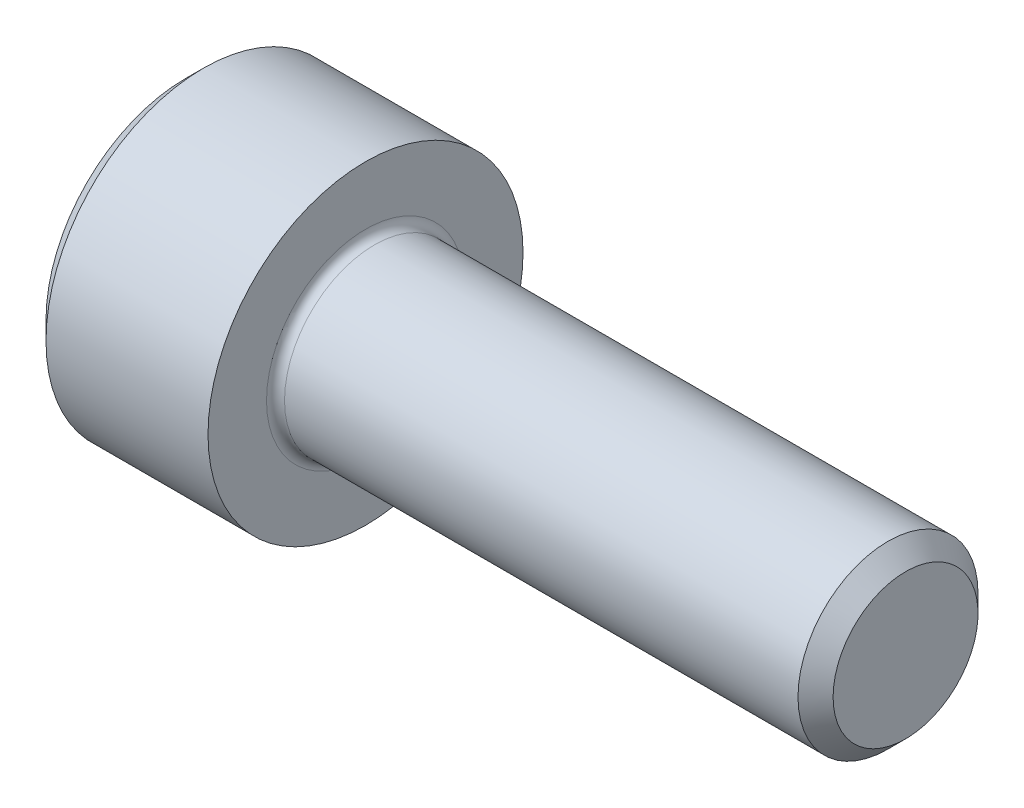
ISO-10303-21;
HEADER;
FILE_DESCRIPTION(('STEP AP214'),'2;1');
FILE_NAME('part.step','',(''),(''),'','','');
FILE_SCHEMA(('AUTOMOTIVE_DESIGN { 1 0 10303 214 1 1 1 1 }'));
ENDSEC;
DATA;
#1=APPLICATION_CONTEXT('core data for automotive mechanical design processes');
#2=APPLICATION_PROTOCOL_DEFINITION('international standard','automotive_design',2000,#1);
#3=PRODUCT_CONTEXT('',#1,'mechanical');
#4=PRODUCT('Part','Part','',(#3));
#5=PRODUCT_RELATED_PRODUCT_CATEGORY('part','',(#4));
#6=PRODUCT_DEFINITION_FORMATION('','',#4);
#7=PRODUCT_DEFINITION_CONTEXT('part definition',#1,'design');
#8=PRODUCT_DEFINITION('design','',#6,#7);
#9=PRODUCT_DEFINITION_SHAPE('','',#8);
#10=(LENGTH_UNIT() NAMED_UNIT(*) SI_UNIT(.MILLI.,.METRE.));
#11=(NAMED_UNIT(*) PLANE_ANGLE_UNIT() SI_UNIT($,.RADIAN.));
#12=(NAMED_UNIT(*) SI_UNIT($,.STERADIAN.) SOLID_ANGLE_UNIT());
#13=UNCERTAINTY_MEASURE_WITH_UNIT(LENGTH_MEASURE(1.E-05),#10,'distance_accuracy_value','');
#14=(GEOMETRIC_REPRESENTATION_CONTEXT(3) GLOBAL_UNCERTAINTY_ASSIGNED_CONTEXT((#13)) GLOBAL_UNIT_ASSIGNED_CONTEXT((#10,
#11,#12)) REPRESENTATION_CONTEXT('',''));
#15=CARTESIAN_POINT('',(0.,0.,0.));
#16=DIRECTION('',(0.,0.,1.));
#17=DIRECTION('',(1.,0.,0.));
#18=AXIS2_PLACEMENT_3D('',#15,#16,#17);
#19=CARTESIAN_POINT('',(0.,0.,0.));
#20=DIRECTION('',(-1.,0.,0.));
#21=DIRECTION('',(0.,0.,1.));
#22=AXIS2_PLACEMENT_3D('',#19,#20,#21);
#23=PLANE('',#22);
#24=DIRECTION('',(0.,-0.499999999999999,0.86602540378444));
#25=VECTOR('',#24,1.);
#26=CARTESIAN_POINT('',(0.,1.77304267668134,0.));
#27=LINE('',#26,#25);
#28=CARTESIAN_POINT('',(0.,1.77304267668134,0.));
#29=VERTEX_POINT('',#28);
#30=CARTESIAN_POINT('',(0.,0.88652133834067,1.5355));
#31=VERTEX_POINT('',#30);
#32=EDGE_CURVE('E390',#29,#31,#27,.T.);
#33=ORIENTED_EDGE('',*,*,#32,.T.);
#34=DIRECTION('',(0.,1.,0.));
#35=VECTOR('',#34,1.);
#36=CARTESIAN_POINT('',(0.,-0.886521338340672,1.5355));
#37=LINE('',#36,#35);
#38=CARTESIAN_POINT('',(0.,-0.886521338340672,1.5355));
#39=VERTEX_POINT('',#38);
#40=EDGE_CURVE('E126',#39,#31,#37,.T.);
#41=ORIENTED_EDGE('',*,*,#40,.F.);
#42=DIRECTION('',(0.,-0.500000000000001,-0.866025403784438));
#43=VECTOR('',#42,1.);
#44=CARTESIAN_POINT('',(0.,-0.886521338340672,1.5355));
#45=LINE('',#44,#43);
#46=CARTESIAN_POINT('',(0.,-1.77304267668134,0.));
#47=VERTEX_POINT('',#46);
#48=EDGE_CURVE('E393',#39,#47,#45,.T.);
#49=ORIENTED_EDGE('',*,*,#48,.T.);
#50=DIRECTION('',(0.,0.499999999999999,-0.86602540378444));
#51=VECTOR('',#50,1.);
#52=CARTESIAN_POINT('',(0.,-1.77304267668134,0.));
#53=LINE('',#52,#51);
#54=CARTESIAN_POINT('',(0.,-0.886521338340676,-1.5355));
#55=VERTEX_POINT('',#54);
#56=EDGE_CURVE('E396',#47,#55,#53,.T.);
#57=ORIENTED_EDGE('',*,*,#56,.T.);
#58=DIRECTION('',(0.,-1.,0.));
#59=VECTOR('',#58,1.);
#60=CARTESIAN_POINT('',(0.,0.886521338340665,-1.5355));
#61=LINE('',#60,#59);
#62=CARTESIAN_POINT('',(0.,0.886521338340665,-1.5355));
#63=VERTEX_POINT('',#62);
#64=EDGE_CURVE('E399',#63,#55,#61,.T.);
#65=ORIENTED_EDGE('',*,*,#64,.F.);
#66=DIRECTION('',(0.,-0.500000000000001,-0.866025403784438));
#67=VECTOR('',#66,1.);
#68=CARTESIAN_POINT('',(0.,1.77304267668134,0.));
#69=LINE('',#68,#67);
#70=EDGE_CURVE('E121',#29,#63,#69,.T.);
#71=ORIENTED_EDGE('',*,*,#70,.F.);
#72=EDGE_LOOP('',(#33,#41,#49,#57,#65,#71));
#73=FACE_BOUND('',#72,.T.);
#74=CARTESIAN_POINT('',(0.,0.,0.));
#75=DIRECTION('',(-1.,0.,0.));
#76=DIRECTION('',(0.,0.,1.));
#77=AXIS2_PLACEMENT_3D('',#74,#75,#76);
#78=CIRCLE('',#77,3.10000000000001);
#79=CARTESIAN_POINT('',(0.,0.,3.10000000000001));
#80=VERTEX_POINT('',#79);
#81=EDGE_CURVE('E137',#80,#80,#78,.T.);
#82=ORIENTED_EDGE('',*,*,#81,.T.);
#83=EDGE_LOOP('',(#82));
#84=FACE_BOUND('',#83,.T.);
#85=ADVANCED_FACE('F34',(#73,#84),#23,.T.);
#86=CARTESIAN_POINT('',(16.,1.61,0.));
#87=DIRECTION('',(1.,0.,0.));
#88=DIRECTION('',(0.,0.,-1.));
#89=AXIS2_PLACEMENT_3D('',#86,#87,#88);
#90=PLANE('',#89);
#91=CARTESIAN_POINT('',(16.,0.,0.));
#92=DIRECTION('',(-1.,0.,0.));
#93=DIRECTION('',(0.,0.,1.));
#94=AXIS2_PLACEMENT_3D('',#91,#92,#93);
#95=CIRCLE('',#94,1.61);
#96=CARTESIAN_POINT('',(16.,0.,1.61));
#97=VERTEX_POINT('',#96);
#98=EDGE_CURVE('E150',#97,#97,#95,.T.);
#99=ORIENTED_EDGE('',*,*,#98,.F.);
#100=EDGE_LOOP('',(#99));
#101=FACE_BOUND('',#100,.T.);
#102=ADVANCED_FACE('F171',(#101),#90,.T.);
#103=CARTESIAN_POINT('',(16.,0.,0.));
#104=DIRECTION('',(-1.,0.,0.));
#105=DIRECTION('',(0.,0.,1.));
#106=AXIS2_PLACEMENT_3D('',#103,#104,#105);
#107=CONICAL_SURFACE('',#106,1.61,0.785398163397484);
#108=CARTESIAN_POINT('',(15.61,0.,0.));
#109=DIRECTION('',(-1.,0.,0.));
#110=DIRECTION('',(0.,0.,1.));
#111=AXIS2_PLACEMENT_3D('',#108,#109,#110);
#112=CIRCLE('',#111,2.);
#113=CARTESIAN_POINT('',(15.61,0.,2.));
#114=VERTEX_POINT('',#113);
#115=EDGE_CURVE('E147',#114,#114,#112,.T.);
#116=ORIENTED_EDGE('',*,*,#115,.F.);
#117=EDGE_LOOP('',(#116));
#118=FACE_BOUND('',#117,.T.);
#119=ORIENTED_EDGE('',*,*,#98,.T.);
#120=EDGE_LOOP('',(#119));
#121=FACE_BOUND('',#120,.T.);
#122=ADVANCED_FACE('F177',(#118,#121),#107,.T.);
#123=CARTESIAN_POINT('',(-31.75,0.,0.));
#124=DIRECTION('',(-1.,0.,0.));
#125=DIRECTION('',(0.,0.,1.));
#126=AXIS2_PLACEMENT_3D('',#123,#124,#125);
#127=CYLINDRICAL_SURFACE('',#126,2.);
#128=CARTESIAN_POINT('',(4.2,0.,0.));
#129=DIRECTION('',(1.,0.,0.));
#130=DIRECTION('',(0.,0.,-1.));
#131=AXIS2_PLACEMENT_3D('',#128,#129,#130);
#132=CIRCLE('',#131,2.);
#133=CARTESIAN_POINT('',(4.2,0.,-2.));
#134=VERTEX_POINT('',#133);
#135=EDGE_CURVE('E11',#134,#134,#132,.T.);
#136=ORIENTED_EDGE('',*,*,#135,.T.);
#137=EDGE_LOOP('',(#136));
#138=FACE_BOUND('',#137,.T.);
#139=ORIENTED_EDGE('',*,*,#115,.T.);
#140=EDGE_LOOP('',(#139));
#141=FACE_BOUND('',#140,.T.);
#142=ADVANCED_FACE('F188',(#138,#141),#127,.T.);
#143=CARTESIAN_POINT('',(4.,3.5,0.));
#144=DIRECTION('',(1.,0.,0.));
#145=DIRECTION('',(0.,0.,-1.));
#146=AXIS2_PLACEMENT_3D('',#143,#144,#145);
#147=PLANE('',#146);
#148=CARTESIAN_POINT('',(4.,0.,0.));
#149=DIRECTION('',(1.,0.,0.));
#150=DIRECTION('',(0.,0.,-1.));
#151=AXIS2_PLACEMENT_3D('',#148,#149,#150);
#152=CIRCLE('',#151,2.2);
#153=CARTESIAN_POINT('',(4.,0.,-2.2));
#154=VERTEX_POINT('',#153);
#155=EDGE_CURVE('E42',#154,#154,#152,.F.);
#156=ORIENTED_EDGE('',*,*,#155,.T.);
#157=EDGE_LOOP('',(#156));
#158=FACE_BOUND('',#157,.T.);
#159=CARTESIAN_POINT('',(4.,0.,0.));
#160=DIRECTION('',(-1.,0.,0.));
#161=DIRECTION('',(0.,0.,1.));
#162=AXIS2_PLACEMENT_3D('',#159,#160,#161);
#163=CIRCLE('',#162,3.5);
#164=CARTESIAN_POINT('',(4.,0.,3.5));
#165=VERTEX_POINT('',#164);
#166=EDGE_CURVE('E144',#165,#165,#163,.T.);
#167=ORIENTED_EDGE('',*,*,#166,.F.);
#168=EDGE_LOOP('',(#167));
#169=FACE_BOUND('',#168,.T.);
#170=ADVANCED_FACE('F155',(#158,#169),#147,.T.);
#171=CARTESIAN_POINT('',(-31.75,0.,0.));
#172=DIRECTION('',(-1.,0.,0.));
#173=DIRECTION('',(0.,0.,1.));
#174=AXIS2_PLACEMENT_3D('',#171,#172,#173);
#175=CYLINDRICAL_SURFACE('',#174,3.5);
#176=ORIENTED_EDGE('',*,*,#166,.T.);
#177=EDGE_LOOP('',(#176));
#178=FACE_BOUND('',#177,.T.);
#179=CARTESIAN_POINT('',(0.399999999999998,0.,0.));
#180=DIRECTION('',(-1.,0.,0.));
#181=DIRECTION('',(0.,0.,1.));
#182=AXIS2_PLACEMENT_3D('',#179,#180,#181);
#183=CIRCLE('',#182,3.5);
#184=CARTESIAN_POINT('',(0.399999999999998,0.,3.5));
#185=VERTEX_POINT('',#184);
#186=EDGE_CURVE('E141',#185,#185,#183,.T.);
#187=ORIENTED_EDGE('',*,*,#186,.F.);
#188=EDGE_LOOP('',(#187));
#189=FACE_BOUND('',#188,.T.);
#190=ADVANCED_FACE('F166',(#178,#189),#175,.T.);
#191=CARTESIAN_POINT('',(0.,0.,0.));
#192=DIRECTION('',(1.,0.,0.));
#193=DIRECTION('',(0.,0.,-1.));
#194=AXIS2_PLACEMENT_3D('',#191,#192,#193);
#195=CONICAL_SURFACE('',#194,3.10000000000001,0.785398163397442);
#196=ORIENTED_EDGE('',*,*,#186,.T.);
#197=EDGE_LOOP('',(#196));
#198=FACE_BOUND('',#197,.T.);
#199=ORIENTED_EDGE('',*,*,#81,.F.);
#200=EDGE_LOOP('',(#199));
#201=FACE_BOUND('',#200,.T.);
#202=ADVANCED_FACE('F159',(#198,#201),#195,.T.);
#203=CARTESIAN_POINT('',(4.2,0.,0.));
#204=DIRECTION('',(1.,0.,0.));
#205=DIRECTION('',(0.,0.,-1.));
#206=AXIS2_PLACEMENT_3D('',#203,#204,#205);
#207=TOROIDAL_SURFACE('',#206,2.2,0.2);
#208=ORIENTED_EDGE('',*,*,#135,.F.);
#209=EDGE_LOOP('',(#208));
#210=FACE_BOUND('',#209,.T.);
#211=ORIENTED_EDGE('',*,*,#155,.F.);
#212=EDGE_LOOP('',(#211));
#213=FACE_BOUND('',#212,.T.);
#214=ADVANCED_FACE('F36',(#210,#213),#207,.F.);
#215=CARTESIAN_POINT('',(2.,1.77304267668134,0.));
#216=DIRECTION('',(0.,-0.86602540378444,-0.499999999999999));
#217=DIRECTION('',(0.,0.499999999999999,-0.86602540378444));
#218=AXIS2_PLACEMENT_3D('',#215,#216,#217);
#219=PLANE('',#218);
#220=ORIENTED_EDGE('',*,*,#32,.F.);
#221=DIRECTION('',(-1.,0.,0.));
#222=VECTOR('',#221,1.);
#223=CARTESIAN_POINT('',(2.,1.77304267668134,0.));
#224=LINE('',#223,#222);
#225=CARTESIAN_POINT('',(2.,1.77304267668134,0.));
#226=VERTEX_POINT('',#225);
#227=EDGE_CURVE('E389',#226,#29,#224,.T.);
#228=ORIENTED_EDGE('',*,*,#227,.F.);
#229=DIRECTION('',(0.,-0.499999999999999,0.86602540378444));
#230=VECTOR('',#229,1.);
#231=CARTESIAN_POINT('',(2.,1.77304267668134,0.));
#232=LINE('',#231,#230);
#233=CARTESIAN_POINT('',(2.,1.32978200751101,0.767749999999998));
#234=VERTEX_POINT('',#233);
#235=EDGE_CURVE('E49',#226,#234,#232,.T.);
#236=ORIENTED_EDGE('',*,*,#235,.T.);
#237=CARTESIAN_POINT('',(2.,0.88652133834067,1.5355));
#238=VERTEX_POINT('',#237);
#239=EDGE_CURVE('E107',#234,#238,#232,.T.);
#240=ORIENTED_EDGE('',*,*,#239,.T.);
#241=DIRECTION('',(-1.,0.,0.));
#242=VECTOR('',#241,1.);
#243=CARTESIAN_POINT('',(2.,0.88652133834067,1.5355));
#244=LINE('',#243,#242);
#245=EDGE_CURVE('E119',#238,#31,#244,.T.);
#246=ORIENTED_EDGE('',*,*,#245,.T.);
#247=EDGE_LOOP('',(#220,#228,#236,#240,#246));
#248=FACE_BOUND('',#247,.T.);
#249=ADVANCED_FACE('F118',(#248),#219,.T.);
#250=CARTESIAN_POINT('',(2.,-0.886521338340672,1.5355));
#251=DIRECTION('',(0.,0.,1.));
#252=DIRECTION('',(0.,-1.,0.));
#253=AXIS2_PLACEMENT_3D('',#250,#251,#252);
#254=PLANE('',#253);
#255=ORIENTED_EDGE('',*,*,#40,.T.);
#256=ORIENTED_EDGE('',*,*,#245,.F.);
#257=DIRECTION('',(0.,1.,0.));
#258=VECTOR('',#257,1.);
#259=CARTESIAN_POINT('',(2.,-0.886521338340672,1.5355));
#260=LINE('',#259,#258);
#261=CARTESIAN_POINT('',(2.,0.,1.5355));
#262=VERTEX_POINT('',#261);
#263=EDGE_CURVE('E105',#262,#238,#260,.T.);
#264=ORIENTED_EDGE('',*,*,#263,.F.);
#265=CARTESIAN_POINT('',(2.,-0.886521338340672,1.5355));
#266=VERTEX_POINT('',#265);
#267=EDGE_CURVE('E115',#266,#262,#260,.T.);
#268=ORIENTED_EDGE('',*,*,#267,.F.);
#269=DIRECTION('',(-1.,0.,0.));
#270=VECTOR('',#269,1.);
#271=CARTESIAN_POINT('',(2.,-0.886521338340672,1.5355));
#272=LINE('',#271,#270);
#273=EDGE_CURVE('E128',#266,#39,#272,.T.);
#274=ORIENTED_EDGE('',*,*,#273,.T.);
#275=EDGE_LOOP('',(#255,#256,#264,#268,#274));
#276=FACE_BOUND('',#275,.T.);
#277=ADVANCED_FACE('F123',(#276),#254,.F.);
#278=CARTESIAN_POINT('',(2.,-0.886521338340672,1.5355));
#279=DIRECTION('',(0.,0.866025403784438,-0.500000000000001));
#280=DIRECTION('',(0.,0.500000000000001,0.866025403784438));
#281=AXIS2_PLACEMENT_3D('',#278,#279,#280);
#282=PLANE('',#281);
#283=ORIENTED_EDGE('',*,*,#48,.F.);
#284=ORIENTED_EDGE('',*,*,#273,.F.);
#285=DIRECTION('',(0.,-0.500000000000001,-0.866025403784438));
#286=VECTOR('',#285,1.);
#287=CARTESIAN_POINT('',(2.,-0.886521338340672,1.5355));
#288=LINE('',#287,#286);
#289=CARTESIAN_POINT('',(2.,-1.32978200751101,0.767750000000003));
#290=VERTEX_POINT('',#289);
#291=EDGE_CURVE('E370',#266,#290,#288,.T.);
#292=ORIENTED_EDGE('',*,*,#291,.T.);
#293=CARTESIAN_POINT('',(2.,-1.77304267668134,0.));
#294=VERTEX_POINT('',#293);
#295=EDGE_CURVE('E372',#290,#294,#288,.T.);
#296=ORIENTED_EDGE('',*,*,#295,.T.);
#297=DIRECTION('',(-1.,0.,0.));
#298=VECTOR('',#297,1.);
#299=CARTESIAN_POINT('',(2.,-1.77304267668134,0.));
#300=LINE('',#299,#298);
#301=EDGE_CURVE('E133',#294,#47,#300,.T.);
#302=ORIENTED_EDGE('',*,*,#301,.T.);
#303=EDGE_LOOP('',(#283,#284,#292,#296,#302));
#304=FACE_BOUND('',#303,.T.);
#305=ADVANCED_FACE('F262',(#304),#282,.T.);
#306=CARTESIAN_POINT('',(2.,-1.77304267668134,0.));
#307=DIRECTION('',(0.,0.86602540378444,0.499999999999999));
#308=DIRECTION('',(0.,-0.499999999999999,0.86602540378444));
#309=AXIS2_PLACEMENT_3D('',#306,#307,#308);
#310=PLANE('',#309);
#311=ORIENTED_EDGE('',*,*,#56,.F.);
#312=ORIENTED_EDGE('',*,*,#301,.F.);
#313=DIRECTION('',(0.,0.499999999999999,-0.86602540378444));
#314=VECTOR('',#313,1.);
#315=CARTESIAN_POINT('',(2.,-1.77304267668134,0.));
#316=LINE('',#315,#314);
#317=CARTESIAN_POINT('',(2.,-1.32978200751101,-0.76775));
#318=VERTEX_POINT('',#317);
#319=EDGE_CURVE('E375',#294,#318,#316,.T.);
#320=ORIENTED_EDGE('',*,*,#319,.T.);
#321=CARTESIAN_POINT('',(2.,-0.886521338340676,-1.5355));
#322=VERTEX_POINT('',#321);
#323=EDGE_CURVE('E379',#318,#322,#316,.T.);
#324=ORIENTED_EDGE('',*,*,#323,.T.);
#325=DIRECTION('',(-1.,0.,0.));
#326=VECTOR('',#325,1.);
#327=CARTESIAN_POINT('',(2.,-0.886521338340676,-1.5355));
#328=LINE('',#327,#326);
#329=EDGE_CURVE('E408',#322,#55,#328,.T.);
#330=ORIENTED_EDGE('',*,*,#329,.T.);
#331=EDGE_LOOP('',(#311,#312,#320,#324,#330));
#332=FACE_BOUND('',#331,.T.);
#333=ADVANCED_FACE('F270',(#332),#310,.T.);
#334=CARTESIAN_POINT('',(2.,0.886521338340665,-1.5355));
#335=DIRECTION('',(0.,0.,-1.));
#336=DIRECTION('',(0.,1.,0.));
#337=AXIS2_PLACEMENT_3D('',#334,#335,#336);
#338=PLANE('',#337);
#339=ORIENTED_EDGE('',*,*,#64,.T.);
#340=ORIENTED_EDGE('',*,*,#329,.F.);
#341=DIRECTION('',(0.,-1.,0.));
#342=VECTOR('',#341,1.);
#343=CARTESIAN_POINT('',(2.,0.886521338340665,-1.5355));
#344=LINE('',#343,#342);
#345=CARTESIAN_POINT('',(2.,0.,-1.5355));
#346=VERTEX_POINT('',#345);
#347=EDGE_CURVE('E383',#346,#322,#344,.T.);
#348=ORIENTED_EDGE('',*,*,#347,.F.);
#349=CARTESIAN_POINT('',(2.,0.886521338340665,-1.5355));
#350=VERTEX_POINT('',#349);
#351=EDGE_CURVE('E384',#350,#346,#344,.T.);
#352=ORIENTED_EDGE('',*,*,#351,.F.);
#353=DIRECTION('',(-1.,0.,0.));
#354=VECTOR('',#353,1.);
#355=CARTESIAN_POINT('',(2.,0.886521338340665,-1.5355));
#356=LINE('',#355,#354);
#357=EDGE_CURVE('E405',#350,#63,#356,.T.);
#358=ORIENTED_EDGE('',*,*,#357,.T.);
#359=EDGE_LOOP('',(#339,#340,#348,#352,#358));
#360=FACE_BOUND('',#359,.T.);
#361=ADVANCED_FACE('F279',(#360),#338,.F.);
#362=CARTESIAN_POINT('',(2.,1.77304267668134,0.));
#363=DIRECTION('',(0.,0.866025403784438,-0.500000000000001));
#364=DIRECTION('',(0.,0.500000000000001,0.866025403784438));
#365=AXIS2_PLACEMENT_3D('',#362,#363,#364);
#366=PLANE('',#365);
#367=ORIENTED_EDGE('',*,*,#70,.T.);
#368=ORIENTED_EDGE('',*,*,#357,.F.);
#369=DIRECTION('',(0.,-0.500000000000001,-0.866025403784438));
#370=VECTOR('',#369,1.);
#371=CARTESIAN_POINT('',(2.,1.77304267668134,0.));
#372=LINE('',#371,#370);
#373=CARTESIAN_POINT('',(2.,1.329782007511,-0.767750000000001));
#374=VERTEX_POINT('',#373);
#375=EDGE_CURVE('E387',#374,#350,#372,.T.);
#376=ORIENTED_EDGE('',*,*,#375,.F.);
#377=EDGE_CURVE('E361',#226,#374,#372,.T.);
#378=ORIENTED_EDGE('',*,*,#377,.F.);
#379=ORIENTED_EDGE('',*,*,#227,.T.);
#380=EDGE_LOOP('',(#367,#368,#376,#378,#379));
#381=FACE_BOUND('',#380,.T.);
#382=ADVANCED_FACE('F288',(#381),#366,.F.);
#383=CARTESIAN_POINT('',(2.,0.886521338340669,1.5355));
#384=DIRECTION('',(-1.,0.,0.));
#385=DIRECTION('',(0.,0.,1.));
#386=AXIS2_PLACEMENT_3D('',#383,#384,#385);
#387=PLANE('',#386);
#388=CARTESIAN_POINT('',(2.,0.,0.));
#389=DIRECTION('',(-1.,0.,0.));
#390=DIRECTION('',(0.,0.,1.));
#391=AXIS2_PLACEMENT_3D('',#388,#389,#390);
#392=CIRCLE('',#391,1.5355);
#393=EDGE_CURVE('E127',#290,#262,#392,.T.);
#394=ORIENTED_EDGE('',*,*,#393,.F.);
#395=ORIENTED_EDGE('',*,*,#291,.F.);
#396=ORIENTED_EDGE('',*,*,#267,.T.);
#397=EDGE_LOOP('',(#394,#395,#396));
#398=FACE_BOUND('',#397,.T.);
#399=ADVANCED_FACE('F297',(#398),#387,.T.);
#400=EDGE_CURVE('E131',#318,#290,#392,.T.);
#401=ORIENTED_EDGE('',*,*,#400,.F.);
#402=ORIENTED_EDGE('',*,*,#319,.F.);
#403=ORIENTED_EDGE('',*,*,#295,.F.);
#404=EDGE_LOOP('',(#401,#402,#403));
#405=FACE_BOUND('',#404,.T.);
#406=ADVANCED_FACE('F306',(#405),#387,.T.);
#407=EDGE_CURVE('E414',#346,#318,#392,.T.);
#408=ORIENTED_EDGE('',*,*,#407,.F.);
#409=ORIENTED_EDGE('',*,*,#347,.T.);
#410=ORIENTED_EDGE('',*,*,#323,.F.);
#411=EDGE_LOOP('',(#408,#409,#410));
#412=FACE_BOUND('',#411,.T.);
#413=ADVANCED_FACE('F315',(#412),#387,.T.);
#414=EDGE_CURVE('E364',#374,#346,#392,.T.);
#415=ORIENTED_EDGE('',*,*,#414,.F.);
#416=ORIENTED_EDGE('',*,*,#375,.T.);
#417=ORIENTED_EDGE('',*,*,#351,.T.);
#418=EDGE_LOOP('',(#415,#416,#417));
#419=FACE_BOUND('',#418,.T.);
#420=ADVANCED_FACE('F323',(#419),#387,.T.);
#421=EDGE_CURVE('E138',#234,#374,#392,.T.);
#422=ORIENTED_EDGE('',*,*,#421,.F.);
#423=ORIENTED_EDGE('',*,*,#235,.F.);
#424=ORIENTED_EDGE('',*,*,#377,.T.);
#425=EDGE_LOOP('',(#422,#423,#424));
#426=FACE_BOUND('',#425,.T.);
#427=ADVANCED_FACE('F331',(#426),#387,.T.);
#428=EDGE_CURVE('E110',#262,#234,#392,.T.);
#429=ORIENTED_EDGE('',*,*,#428,.F.);
#430=ORIENTED_EDGE('',*,*,#263,.T.);
#431=ORIENTED_EDGE('',*,*,#239,.F.);
#432=EDGE_LOOP('',(#429,#430,#431));
#433=FACE_BOUND('',#432,.T.);
#434=ADVANCED_FACE('F106',(#433),#387,.T.);
#435=CARTESIAN_POINT('',(2.,0.,0.));
#436=DIRECTION('',(-1.,0.,0.));
#437=DIRECTION('',(0.,0.,1.));
#438=AXIS2_PLACEMENT_3D('',#435,#436,#437);
#439=CONICAL_SURFACE('',#438,1.5355,1.04719755119659);
#440=CARTESIAN_POINT('',(2.88652133834068,0.,0.));
#441=VERTEX_POINT('',#440);
#442=VERTEX_LOOP('',#441);
#443=FACE_BOUND('',#442,.T.);
#444=ORIENTED_EDGE('',*,*,#428,.T.);
#445=ORIENTED_EDGE('',*,*,#421,.T.);
#446=ORIENTED_EDGE('',*,*,#414,.T.);
#447=ORIENTED_EDGE('',*,*,#407,.T.);
#448=ORIENTED_EDGE('',*,*,#400,.T.);
#449=ORIENTED_EDGE('',*,*,#393,.T.);
#450=EDGE_LOOP('',(#444,#445,#446,#447,#448,#449));
#451=FACE_BOUND('',#450,.T.);
#452=ADVANCED_FACE('F181',(#443,#451),#439,.F.);
#453=CLOSED_SHELL('',(#85,#102,#122,#142,#170,#190,#202,#214,#249,#277,#305,#333,#361,#382,#399,
#406,#413,#420,#427,#434,#452));
#454=MANIFOLD_SOLID_BREP('B2',#453);
#455=ADVANCED_BREP_SHAPE_REPRESENTATION('',(#18,#454),#14);
#456=SHAPE_DEFINITION_REPRESENTATION(#9,#455);
ENDSEC;
END-ISO-10303-21;
